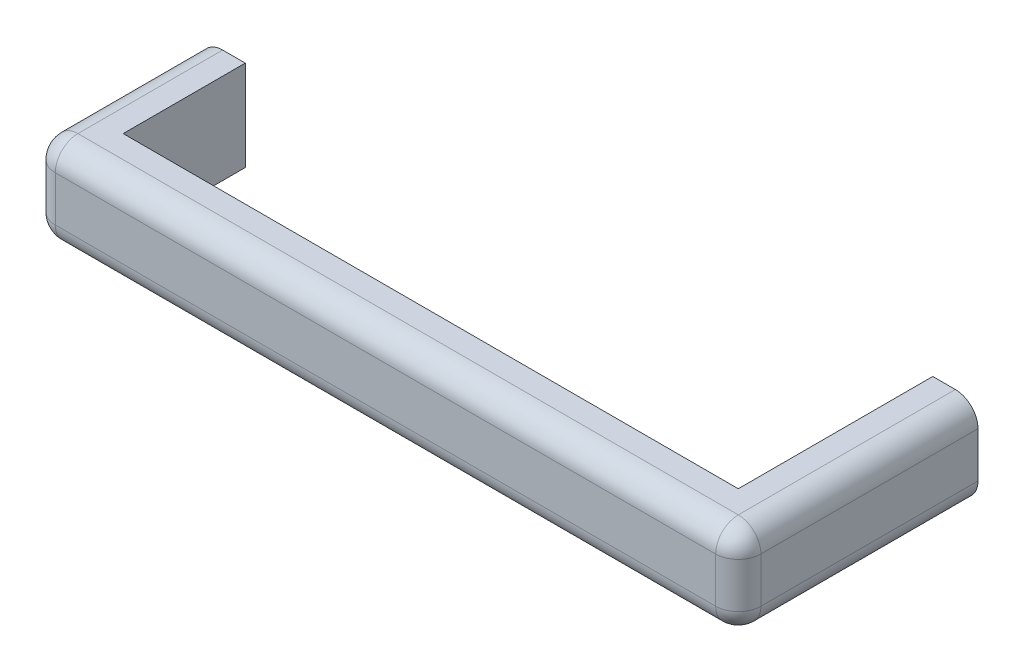
ISO-10303-21;
HEADER;
FILE_DESCRIPTION(('STEP AP214'),'2;1');
FILE_NAME('part.step','',(''),(''),'','','');
FILE_SCHEMA(('AUTOMOTIVE_DESIGN { 1 0 10303 214 1 1 1 1 }'));
ENDSEC;
DATA;
#1=APPLICATION_CONTEXT('core data for automotive mechanical design processes');
#2=APPLICATION_PROTOCOL_DEFINITION('international standard','automotive_design',2000,#1);
#3=PRODUCT_CONTEXT('',#1,'mechanical');
#4=PRODUCT('Part','Part','',(#3));
#5=PRODUCT_RELATED_PRODUCT_CATEGORY('part','',(#4));
#6=PRODUCT_DEFINITION_FORMATION('','',#4);
#7=PRODUCT_DEFINITION_CONTEXT('part definition',#1,'design');
#8=PRODUCT_DEFINITION('design','',#6,#7);
#9=PRODUCT_DEFINITION_SHAPE('','',#8);
#10=(LENGTH_UNIT() NAMED_UNIT(*) SI_UNIT(.MILLI.,.METRE.));
#11=(NAMED_UNIT(*) PLANE_ANGLE_UNIT() SI_UNIT($,.RADIAN.));
#12=(NAMED_UNIT(*) SI_UNIT($,.STERADIAN.) SOLID_ANGLE_UNIT());
#13=UNCERTAINTY_MEASURE_WITH_UNIT(LENGTH_MEASURE(1.E-05),#10,'distance_accuracy_value','');
#14=(GEOMETRIC_REPRESENTATION_CONTEXT(3) GLOBAL_UNCERTAINTY_ASSIGNED_CONTEXT((#13)) GLOBAL_UNIT_ASSIGNED_CONTEXT((#10,
#11,#12)) REPRESENTATION_CONTEXT('',''));
#15=CARTESIAN_POINT('',(0.,0.,0.));
#16=DIRECTION('',(0.,0.,1.));
#17=DIRECTION('',(1.,0.,0.));
#18=AXIS2_PLACEMENT_3D('',#15,#16,#17);
#19=CARTESIAN_POINT('',(0.,127.,-63.4999999999999));
#20=DIRECTION('',(1.,0.,0.));
#21=DIRECTION('',(0.,0.,-1.));
#22=AXIS2_PLACEMENT_3D('',#19,#20,#21);
#23=PLANE('',#22);
#24=DIRECTION('',(0.,-1.,0.));
#25=VECTOR('',#24,1.);
#26=CARTESIAN_POINT('',(0.,127.,-234.95));
#27=LINE('',#26,#25);
#28=CARTESIAN_POINT('',(0.,95.25,-234.95));
#29=VERTEX_POINT('',#28);
#30=CARTESIAN_POINT('',(0.,31.75,-234.95));
#31=VERTEX_POINT('',#30);
#32=EDGE_CURVE('E165',#29,#31,#27,.T.);
#33=ORIENTED_EDGE('',*,*,#32,.T.);
#34=DIRECTION('',(0.,0.,1.));
#35=VECTOR('',#34,1.);
#36=CARTESIAN_POINT('',(0.,31.75,0.));
#37=LINE('',#36,#35);
#38=CARTESIAN_POINT('',(0.,31.75,-31.75));
#39=VERTEX_POINT('',#38);
#40=EDGE_CURVE('E205',#31,#39,#37,.T.);
#41=ORIENTED_EDGE('',*,*,#40,.T.);
#42=DIRECTION('',(0.,-1.,0.));
#43=VECTOR('',#42,1.);
#44=CARTESIAN_POINT('',(0.,127.,-31.75));
#45=LINE('',#44,#43);
#46=CARTESIAN_POINT('',(0.,95.25,-31.75));
#47=VERTEX_POINT('',#46);
#48=EDGE_CURVE('E203',#39,#47,#45,.F.);
#49=ORIENTED_EDGE('',*,*,#48,.T.);
#50=DIRECTION('',(0.,0.,1.));
#51=VECTOR('',#50,1.);
#52=CARTESIAN_POINT('',(0.,95.25,-63.4999999999999));
#53=LINE('',#52,#51);
#54=EDGE_CURVE('E201',#47,#29,#53,.F.);
#55=ORIENTED_EDGE('',*,*,#54,.T.);
#56=EDGE_LOOP('',(#33,#41,#49,#55));
#57=FACE_BOUND('',#56,.T.);
#58=ADVANCED_FACE('F34',(#57),#23,.F.);
#59=CARTESIAN_POINT('',(0.,127.,0.));
#60=DIRECTION('',(0.,0.,-1.));
#61=DIRECTION('',(-1.,0.,0.));
#62=AXIS2_PLACEMENT_3D('',#59,#60,#61);
#63=PLANE('',#62);
#64=DIRECTION('',(0.,-1.,0.));
#65=VECTOR('',#64,1.);
#66=CARTESIAN_POINT('',(31.7499999999999,127.,0.));
#67=LINE('',#66,#65);
#68=CARTESIAN_POINT('',(31.7499999999999,95.25,0.));
#69=VERTEX_POINT('',#68);
#70=CARTESIAN_POINT('',(31.7499999999999,31.75,0.));
#71=VERTEX_POINT('',#70);
#72=EDGE_CURVE('E194',#69,#71,#67,.T.);
#73=ORIENTED_EDGE('',*,*,#72,.T.);
#74=DIRECTION('',(1.,0.,0.));
#75=VECTOR('',#74,1.);
#76=CARTESIAN_POINT('',(990.599999999999,31.75,0.));
#77=LINE('',#76,#75);
#78=CARTESIAN_POINT('',(958.85,31.75,0.));
#79=VERTEX_POINT('',#78);
#80=EDGE_CURVE('E199',#71,#79,#77,.T.);
#81=ORIENTED_EDGE('',*,*,#80,.T.);
#82=DIRECTION('',(0.,-1.,0.));
#83=VECTOR('',#82,1.);
#84=CARTESIAN_POINT('',(958.85,127.,0.));
#85=LINE('',#84,#83);
#86=CARTESIAN_POINT('',(958.85,95.25,0.));
#87=VERTEX_POINT('',#86);
#88=EDGE_CURVE('E196',#79,#87,#85,.F.);
#89=ORIENTED_EDGE('',*,*,#88,.T.);
#90=DIRECTION('',(1.,0.,0.));
#91=VECTOR('',#90,1.);
#92=CARTESIAN_POINT('',(0.,95.25,0.));
#93=LINE('',#92,#91);
#94=EDGE_CURVE('E192',#87,#69,#93,.F.);
#95=ORIENTED_EDGE('',*,*,#94,.T.);
#96=EDGE_LOOP('',(#73,#81,#89,#95));
#97=FACE_BOUND('',#96,.T.);
#98=ADVANCED_FACE('F319',(#97),#63,.F.);
#99=CARTESIAN_POINT('',(990.599999999999,127.,-63.5));
#100=DIRECTION('',(-1.,0.,0.));
#101=DIRECTION('',(0.,0.,1.));
#102=AXIS2_PLACEMENT_3D('',#99,#100,#101);
#103=PLANE('',#102);
#104=DIRECTION('',(0.,-1.,0.));
#105=VECTOR('',#104,1.);
#106=CARTESIAN_POINT('',(990.599999999999,127.,-31.75));
#107=LINE('',#106,#105);
#108=CARTESIAN_POINT('',(990.599999999999,95.25,-31.75));
#109=VERTEX_POINT('',#108);
#110=CARTESIAN_POINT('',(990.599999999999,31.75,-31.75));
#111=VERTEX_POINT('',#110);
#112=EDGE_CURVE('E187',#109,#111,#107,.T.);
#113=ORIENTED_EDGE('',*,*,#112,.T.);
#114=DIRECTION('',(0.,0.,-1.));
#115=VECTOR('',#114,1.);
#116=CARTESIAN_POINT('',(990.599999999999,31.75,-336.55));
#117=LINE('',#116,#115);
#118=CARTESIAN_POINT('',(990.599999999999,31.75,-336.55));
#119=VERTEX_POINT('',#118);
#120=EDGE_CURVE('E190',#111,#119,#117,.T.);
#121=ORIENTED_EDGE('',*,*,#120,.T.);
#122=DIRECTION('',(0.,-1.,0.));
#123=VECTOR('',#122,1.);
#124=CARTESIAN_POINT('',(990.599999999999,127.,-336.55));
#125=LINE('',#124,#123);
#126=CARTESIAN_POINT('',(990.599999999999,95.25,-336.55));
#127=VERTEX_POINT('',#126);
#128=EDGE_CURVE('E151',#127,#119,#125,.T.);
#129=ORIENTED_EDGE('',*,*,#128,.F.);
#130=DIRECTION('',(0.,0.,-1.));
#131=VECTOR('',#130,1.);
#132=CARTESIAN_POINT('',(990.599999999999,95.25,-63.5));
#133=LINE('',#132,#131);
#134=EDGE_CURVE('E185',#127,#109,#133,.F.);
#135=ORIENTED_EDGE('',*,*,#134,.T.);
#136=EDGE_LOOP('',(#113,#121,#129,#135));
#137=FACE_BOUND('',#136,.T.);
#138=ADVANCED_FACE('F275',(#137),#103,.F.);
#139=CARTESIAN_POINT('',(990.599999999999,127.,-336.55));
#140=DIRECTION('',(0.,0.,1.));
#141=DIRECTION('',(1.,0.,0.));
#142=AXIS2_PLACEMENT_3D('',#139,#140,#141);
#143=PLANE('',#142);
#144=ORIENTED_EDGE('',*,*,#128,.T.);
#145=CARTESIAN_POINT('',(958.85,31.75,-336.55));
#146=DIRECTION('',(0.,0.,1.));
#147=DIRECTION('',(1.,0.,0.));
#148=AXIS2_PLACEMENT_3D('',#145,#146,#147);
#149=CIRCLE('',#148,31.75);
#150=CARTESIAN_POINT('',(958.85,0.,-336.55));
#151=VERTEX_POINT('',#150);
#152=EDGE_CURVE('E209',#119,#151,#149,.F.);
#153=ORIENTED_EDGE('',*,*,#152,.T.);
#154=DIRECTION('',(-1.,0.,0.));
#155=VECTOR('',#154,1.);
#156=CARTESIAN_POINT('',(990.599999999999,0.,-336.55));
#157=LINE('',#156,#155);
#158=CARTESIAN_POINT('',(927.099999999999,0.,-336.55));
#159=VERTEX_POINT('',#158);
#160=EDGE_CURVE('E148',#151,#159,#157,.T.);
#161=ORIENTED_EDGE('',*,*,#160,.T.);
#162=DIRECTION('',(0.,-1.,0.));
#163=VECTOR('',#162,1.);
#164=CARTESIAN_POINT('',(927.099999999999,127.,-336.55));
#165=LINE('',#164,#163);
#166=CARTESIAN_POINT('',(927.099999999999,127.,-336.55));
#167=VERTEX_POINT('',#166);
#168=EDGE_CURVE('E144',#167,#159,#165,.T.);
#169=ORIENTED_EDGE('',*,*,#168,.F.);
#170=DIRECTION('',(-1.,0.,0.));
#171=VECTOR('',#170,1.);
#172=CARTESIAN_POINT('',(990.599999999999,127.,-336.55));
#173=LINE('',#172,#171);
#174=CARTESIAN_POINT('',(958.85,127.,-336.55));
#175=VERTEX_POINT('',#174);
#176=EDGE_CURVE('E133',#175,#167,#173,.T.);
#177=ORIENTED_EDGE('',*,*,#176,.F.);
#178=CARTESIAN_POINT('',(958.85,95.25,-336.55));
#179=DIRECTION('',(0.,0.,1.));
#180=DIRECTION('',(1.,0.,0.));
#181=AXIS2_PLACEMENT_3D('',#178,#179,#180);
#182=CIRCLE('',#181,31.75);
#183=EDGE_CURVE('E207',#175,#127,#182,.F.);
#184=ORIENTED_EDGE('',*,*,#183,.T.);
#185=EDGE_LOOP('',(#144,#153,#161,#169,#177,#184));
#186=FACE_BOUND('',#185,.T.);
#187=ADVANCED_FACE('F146',(#186),#143,.F.);
#188=CARTESIAN_POINT('',(927.099999999999,127.,-63.5));
#189=DIRECTION('',(1.,0.,0.));
#190=DIRECTION('',(0.,0.,-1.));
#191=AXIS2_PLACEMENT_3D('',#188,#189,#190);
#192=PLANE('',#191);
#193=DIRECTION('',(0.,0.,1.));
#194=VECTOR('',#193,1.);
#195=CARTESIAN_POINT('',(927.099999999999,0.,-63.5));
#196=LINE('',#195,#194);
#197=CARTESIAN_POINT('',(927.099999999999,0.,-63.5));
#198=VERTEX_POINT('',#197);
#199=EDGE_CURVE('E167',#159,#198,#196,.T.);
#200=ORIENTED_EDGE('',*,*,#199,.T.);
#201=DIRECTION('',(0.,-1.,0.));
#202=VECTOR('',#201,1.);
#203=CARTESIAN_POINT('',(927.099999999999,127.,-63.5));
#204=LINE('',#203,#202);
#205=CARTESIAN_POINT('',(927.099999999999,127.,-63.5));
#206=VERTEX_POINT('',#205);
#207=EDGE_CURVE('E152',#206,#198,#204,.T.);
#208=ORIENTED_EDGE('',*,*,#207,.F.);
#209=DIRECTION('',(0.,0.,1.));
#210=VECTOR('',#209,1.);
#211=CARTESIAN_POINT('',(927.099999999999,127.,-63.5));
#212=LINE('',#211,#210);
#213=EDGE_CURVE('E137',#167,#206,#212,.T.);
#214=ORIENTED_EDGE('',*,*,#213,.F.);
#215=ORIENTED_EDGE('',*,*,#168,.T.);
#216=EDGE_LOOP('',(#200,#208,#214,#215));
#217=FACE_BOUND('',#216,.T.);
#218=ADVANCED_FACE('F154',(#217),#192,.F.);
#219=CARTESIAN_POINT('',(63.5000000000001,127.,-63.5));
#220=DIRECTION('',(0.,0.,1.));
#221=DIRECTION('',(1.,0.,0.));
#222=AXIS2_PLACEMENT_3D('',#219,#220,#221);
#223=PLANE('',#222);
#224=DIRECTION('',(-1.,0.,0.));
#225=VECTOR('',#224,1.);
#226=CARTESIAN_POINT('',(63.5000000000001,0.,-63.5));
#227=LINE('',#226,#225);
#228=CARTESIAN_POINT('',(63.5000000000001,0.,-63.5));
#229=VERTEX_POINT('',#228);
#230=EDGE_CURVE('E169',#198,#229,#227,.T.);
#231=ORIENTED_EDGE('',*,*,#230,.T.);
#232=DIRECTION('',(0.,-1.,0.));
#233=VECTOR('',#232,1.);
#234=CARTESIAN_POINT('',(63.5000000000001,127.,-63.5));
#235=LINE('',#234,#233);
#236=CARTESIAN_POINT('',(63.5000000000001,127.,-63.5));
#237=VERTEX_POINT('',#236);
#238=EDGE_CURVE('E180',#237,#229,#235,.T.);
#239=ORIENTED_EDGE('',*,*,#238,.F.);
#240=DIRECTION('',(-1.,0.,0.));
#241=VECTOR('',#240,1.);
#242=CARTESIAN_POINT('',(63.5000000000001,127.,-63.5));
#243=LINE('',#242,#241);
#244=EDGE_CURVE('E157',#206,#237,#243,.T.);
#245=ORIENTED_EDGE('',*,*,#244,.F.);
#246=ORIENTED_EDGE('',*,*,#207,.T.);
#247=EDGE_LOOP('',(#231,#239,#245,#246));
#248=FACE_BOUND('',#247,.T.);
#249=ADVANCED_FACE('F287',(#248),#223,.F.);
#250=CARTESIAN_POINT('',(63.5000000000001,127.,-63.5));
#251=DIRECTION('',(-1.,0.,0.));
#252=DIRECTION('',(0.,0.,1.));
#253=AXIS2_PLACEMENT_3D('',#250,#251,#252);
#254=PLANE('',#253);
#255=DIRECTION('',(0.,0.,-1.));
#256=VECTOR('',#255,1.);
#257=CARTESIAN_POINT('',(63.5000000000001,0.,-63.5));
#258=LINE('',#257,#256);
#259=CARTESIAN_POINT('',(63.5000000000001,0.,-234.95));
#260=VERTEX_POINT('',#259);
#261=EDGE_CURVE('E171',#229,#260,#258,.T.);
#262=ORIENTED_EDGE('',*,*,#261,.T.);
#263=DIRECTION('',(0.,-1.,0.));
#264=VECTOR('',#263,1.);
#265=CARTESIAN_POINT('',(63.5000000000001,127.,-234.95));
#266=LINE('',#265,#264);
#267=CARTESIAN_POINT('',(63.5000000000001,127.,-234.95));
#268=VERTEX_POINT('',#267);
#269=EDGE_CURVE('E177',#268,#260,#266,.T.);
#270=ORIENTED_EDGE('',*,*,#269,.F.);
#271=DIRECTION('',(0.,0.,-1.));
#272=VECTOR('',#271,1.);
#273=CARTESIAN_POINT('',(63.5000000000001,127.,-63.5));
#274=LINE('',#273,#272);
#275=EDGE_CURVE('E159',#237,#268,#274,.T.);
#276=ORIENTED_EDGE('',*,*,#275,.F.);
#277=ORIENTED_EDGE('',*,*,#238,.T.);
#278=EDGE_LOOP('',(#262,#270,#276,#277));
#279=FACE_BOUND('',#278,.T.);
#280=ADVANCED_FACE('F293',(#279),#254,.F.);
#281=CARTESIAN_POINT('',(0.,127.,-234.95));
#282=DIRECTION('',(0.,0.,1.));
#283=DIRECTION('',(1.,0.,0.));
#284=AXIS2_PLACEMENT_3D('',#281,#282,#283);
#285=PLANE('',#284);
#286=DIRECTION('',(-1.,0.,0.));
#287=VECTOR('',#286,1.);
#288=CARTESIAN_POINT('',(0.,0.,-234.95));
#289=LINE('',#288,#287);
#290=CARTESIAN_POINT('',(31.7499999999999,0.,-234.95));
#291=VERTEX_POINT('',#290);
#292=EDGE_CURVE('E141',#260,#291,#289,.T.);
#293=ORIENTED_EDGE('',*,*,#292,.T.);
#294=CARTESIAN_POINT('',(31.7499999999999,31.75,-234.95));
#295=DIRECTION('',(0.,0.,1.));
#296=DIRECTION('',(1.,0.,0.));
#297=AXIS2_PLACEMENT_3D('',#294,#295,#296);
#298=CIRCLE('',#297,31.75);
#299=EDGE_CURVE('E219',#291,#31,#298,.F.);
#300=ORIENTED_EDGE('',*,*,#299,.T.);
#301=ORIENTED_EDGE('',*,*,#32,.F.);
#302=CARTESIAN_POINT('',(31.7499999999999,95.25,-234.95));
#303=DIRECTION('',(0.,0.,1.));
#304=DIRECTION('',(1.,0.,0.));
#305=AXIS2_PLACEMENT_3D('',#302,#303,#304);
#306=CIRCLE('',#305,31.75);
#307=CARTESIAN_POINT('',(31.7499999999999,127.,-234.95));
#308=VERTEX_POINT('',#307);
#309=EDGE_CURVE('E217',#29,#308,#306,.F.);
#310=ORIENTED_EDGE('',*,*,#309,.T.);
#311=DIRECTION('',(-1.,0.,0.));
#312=VECTOR('',#311,1.);
#313=CARTESIAN_POINT('',(0.,127.,-234.95));
#314=LINE('',#313,#312);
#315=EDGE_CURVE('E163',#268,#308,#314,.T.);
#316=ORIENTED_EDGE('',*,*,#315,.F.);
#317=ORIENTED_EDGE('',*,*,#269,.T.);
#318=EDGE_LOOP('',(#293,#300,#301,#310,#316,#317));
#319=FACE_BOUND('',#318,.T.);
#320=ADVANCED_FACE('F296',(#319),#285,.F.);
#321=CARTESIAN_POINT('',(0.,127.,0.));
#322=DIRECTION('',(0.,-1.,0.));
#323=DIRECTION('',(0.,0.,-1.));
#324=AXIS2_PLACEMENT_3D('',#321,#322,#323);
#325=PLANE('',#324);
#326=DIRECTION('',(1.,0.,0.));
#327=VECTOR('',#326,1.);
#328=CARTESIAN_POINT('',(0.,127.,-31.75));
#329=LINE('',#328,#327);
#330=CARTESIAN_POINT('',(31.7499999999999,127.,-31.75));
#331=VERTEX_POINT('',#330);
#332=CARTESIAN_POINT('',(958.85,127.,-31.75));
#333=VERTEX_POINT('',#332);
#334=EDGE_CURVE('E50',#331,#333,#329,.T.);
#335=ORIENTED_EDGE('',*,*,#334,.T.);
#336=DIRECTION('',(0.,0.,-1.));
#337=VECTOR('',#336,1.);
#338=CARTESIAN_POINT('',(958.85,127.,0.));
#339=LINE('',#338,#337);
#340=EDGE_CURVE('E11',#333,#175,#339,.T.);
#341=ORIENTED_EDGE('',*,*,#340,.T.);
#342=ORIENTED_EDGE('',*,*,#176,.T.);
#343=ORIENTED_EDGE('',*,*,#213,.T.);
#344=ORIENTED_EDGE('',*,*,#244,.T.);
#345=ORIENTED_EDGE('',*,*,#275,.T.);
#346=ORIENTED_EDGE('',*,*,#315,.T.);
#347=DIRECTION('',(0.,0.,1.));
#348=VECTOR('',#347,1.);
#349=CARTESIAN_POINT('',(31.7499999999999,127.,0.));
#350=LINE('',#349,#348);
#351=EDGE_CURVE('E43',#308,#331,#350,.T.);
#352=ORIENTED_EDGE('',*,*,#351,.T.);
#353=EDGE_LOOP('',(#335,#341,#342,#343,#344,#345,#346,#352));
#354=FACE_BOUND('',#353,.T.);
#355=ADVANCED_FACE('F135',(#354),#325,.F.);
#356=CARTESIAN_POINT('',(0.,0.,0.));
#357=DIRECTION('',(0.,-1.,0.));
#358=DIRECTION('',(0.,0.,-1.));
#359=AXIS2_PLACEMENT_3D('',#356,#357,#358);
#360=PLANE('',#359);
#361=ORIENTED_EDGE('',*,*,#160,.F.);
#362=DIRECTION('',(0.,0.,-1.));
#363=VECTOR('',#362,1.);
#364=CARTESIAN_POINT('',(958.85,0.,0.));
#365=LINE('',#364,#363);
#366=CARTESIAN_POINT('',(958.85,0.,-31.75));
#367=VERTEX_POINT('',#366);
#368=EDGE_CURVE('E215',#151,#367,#365,.F.);
#369=ORIENTED_EDGE('',*,*,#368,.T.);
#370=DIRECTION('',(1.,0.,0.));
#371=VECTOR('',#370,1.);
#372=CARTESIAN_POINT('',(0.,0.,-31.75));
#373=LINE('',#372,#371);
#374=CARTESIAN_POINT('',(31.7499999999999,0.,-31.75));
#375=VERTEX_POINT('',#374);
#376=EDGE_CURVE('E211',#367,#375,#373,.F.);
#377=ORIENTED_EDGE('',*,*,#376,.T.);
#378=DIRECTION('',(0.,0.,1.));
#379=VECTOR('',#378,1.);
#380=CARTESIAN_POINT('',(31.7499999999999,0.,-234.95));
#381=LINE('',#380,#379);
#382=EDGE_CURVE('E213',#375,#291,#381,.F.);
#383=ORIENTED_EDGE('',*,*,#382,.T.);
#384=ORIENTED_EDGE('',*,*,#292,.F.);
#385=ORIENTED_EDGE('',*,*,#261,.F.);
#386=ORIENTED_EDGE('',*,*,#230,.F.);
#387=ORIENTED_EDGE('',*,*,#199,.F.);
#388=EDGE_LOOP('',(#361,#369,#377,#383,#384,#385,#386,#387));
#389=FACE_BOUND('',#388,.T.);
#390=ADVANCED_FACE('F282',(#389),#360,.T.);
#391=CARTESIAN_POINT('',(31.7499999999999,95.25,0.));
#392=DIRECTION('',(0.,0.,1.));
#393=DIRECTION('',(1.,0.,0.));
#394=AXIS2_PLACEMENT_3D('',#391,#392,#393);
#395=CYLINDRICAL_SURFACE('',#394,31.75);
#396=ORIENTED_EDGE('',*,*,#309,.F.);
#397=ORIENTED_EDGE('',*,*,#54,.F.);
#398=CARTESIAN_POINT('',(31.7499999999999,95.25,-31.75));
#399=DIRECTION('',(0.,0.,1.));
#400=DIRECTION('',(1.,0.,0.));
#401=AXIS2_PLACEMENT_3D('',#398,#399,#400);
#402=CIRCLE('',#401,31.75);
#403=EDGE_CURVE('E250',#331,#47,#402,.T.);
#404=ORIENTED_EDGE('',*,*,#403,.F.);
#405=ORIENTED_EDGE('',*,*,#351,.F.);
#406=EDGE_LOOP('',(#396,#397,#404,#405));
#407=FACE_BOUND('',#406,.T.);
#408=ADVANCED_FACE('F36',(#407),#395,.T.);
#409=CARTESIAN_POINT('',(31.7499999999999,31.75,-63.4999999999999));
#410=DIRECTION('',(0.,0.,-1.));
#411=DIRECTION('',(-1.,0.,0.));
#412=AXIS2_PLACEMENT_3D('',#409,#410,#411);
#413=CYLINDRICAL_SURFACE('',#412,31.75);
#414=ORIENTED_EDGE('',*,*,#299,.F.);
#415=ORIENTED_EDGE('',*,*,#382,.F.);
#416=CARTESIAN_POINT('',(31.7499999999999,31.75,-31.75));
#417=DIRECTION('',(0.,0.,1.));
#418=DIRECTION('',(1.,0.,0.));
#419=AXIS2_PLACEMENT_3D('',#416,#417,#418);
#420=CIRCLE('',#419,31.75);
#421=EDGE_CURVE('E248',#39,#375,#420,.T.);
#422=ORIENTED_EDGE('',*,*,#421,.F.);
#423=ORIENTED_EDGE('',*,*,#40,.F.);
#424=EDGE_LOOP('',(#414,#415,#422,#423));
#425=FACE_BOUND('',#424,.T.);
#426=ADVANCED_FACE('F310',(#425),#413,.T.);
#427=CARTESIAN_POINT('',(31.7499999999999,127.,-31.75));
#428=DIRECTION('',(0.,-1.,0.));
#429=DIRECTION('',(0.,0.,-1.));
#430=AXIS2_PLACEMENT_3D('',#427,#428,#429);
#431=CYLINDRICAL_SURFACE('',#430,31.75);
#432=CARTESIAN_POINT('',(31.7499999999999,95.25,-31.75));
#433=DIRECTION('',(0.,1.,0.));
#434=DIRECTION('',(0.,0.,1.));
#435=AXIS2_PLACEMENT_3D('',#432,#433,#434);
#436=CIRCLE('',#435,31.75);
#437=EDGE_CURVE('E38',#47,#69,#436,.T.);
#438=ORIENTED_EDGE('',*,*,#437,.F.);
#439=ORIENTED_EDGE('',*,*,#48,.F.);
#440=CARTESIAN_POINT('',(31.7499999999999,31.75,-31.75));
#441=DIRECTION('',(0.,-1.,0.));
#442=DIRECTION('',(0.,0.,-1.));
#443=AXIS2_PLACEMENT_3D('',#440,#441,#442);
#444=CIRCLE('',#443,31.75);
#445=EDGE_CURVE('E245',#71,#39,#444,.T.);
#446=ORIENTED_EDGE('',*,*,#445,.F.);
#447=ORIENTED_EDGE('',*,*,#72,.F.);
#448=EDGE_LOOP('',(#438,#439,#446,#447));
#449=FACE_BOUND('',#448,.T.);
#450=ADVANCED_FACE('F305',(#449),#431,.T.);
#451=CARTESIAN_POINT('',(31.7499999999999,95.25,-31.75));
#452=DIRECTION('',(0.,0.,1.));
#453=DIRECTION('',(1.,0.,0.));
#454=AXIS2_PLACEMENT_3D('',#451,#452,#453);
#455=SPHERICAL_SURFACE('',#454,31.75);
#456=ORIENTED_EDGE('',*,*,#403,.T.);
#457=ORIENTED_EDGE('',*,*,#437,.T.);
#458=CARTESIAN_POINT('',(31.7499999999999,95.25,-31.75));
#459=DIRECTION('',(-1.,0.,0.));
#460=DIRECTION('',(0.,0.,1.));
#461=AXIS2_PLACEMENT_3D('',#458,#459,#460);
#462=CIRCLE('',#461,31.75);
#463=EDGE_CURVE('E242',#331,#69,#462,.F.);
#464=ORIENTED_EDGE('',*,*,#463,.F.);
#465=EDGE_LOOP('',(#456,#457,#464));
#466=FACE_BOUND('',#465,.T.);
#467=ADVANCED_FACE('F256',(#466),#455,.T.);
#468=CARTESIAN_POINT('',(31.7499999999999,31.75,-31.75));
#469=DIRECTION('',(0.,0.,1.));
#470=DIRECTION('',(1.,0.,0.));
#471=AXIS2_PLACEMENT_3D('',#468,#469,#470);
#472=SPHERICAL_SURFACE('',#471,31.75);
#473=ORIENTED_EDGE('',*,*,#445,.T.);
#474=ORIENTED_EDGE('',*,*,#421,.T.);
#475=CARTESIAN_POINT('',(31.7499999999999,31.75,-31.75));
#476=DIRECTION('',(-1.,0.,0.));
#477=DIRECTION('',(0.,0.,1.));
#478=AXIS2_PLACEMENT_3D('',#475,#476,#477);
#479=CIRCLE('',#478,31.75);
#480=EDGE_CURVE('E239',#71,#375,#479,.F.);
#481=ORIENTED_EDGE('',*,*,#480,.F.);
#482=EDGE_LOOP('',(#473,#474,#481));
#483=FACE_BOUND('',#482,.T.);
#484=ADVANCED_FACE('F312',(#483),#472,.T.);
#485=CARTESIAN_POINT('',(0.,95.25,-31.75));
#486=DIRECTION('',(1.,0.,0.));
#487=DIRECTION('',(0.,0.,-1.));
#488=AXIS2_PLACEMENT_3D('',#485,#486,#487);
#489=CYLINDRICAL_SURFACE('',#488,31.75);
#490=ORIENTED_EDGE('',*,*,#463,.T.);
#491=ORIENTED_EDGE('',*,*,#94,.F.);
#492=CARTESIAN_POINT('',(958.85,95.25,-31.75));
#493=DIRECTION('',(1.,0.,0.));
#494=DIRECTION('',(0.,0.,-1.));
#495=AXIS2_PLACEMENT_3D('',#492,#493,#494);
#496=CIRCLE('',#495,31.75);
#497=EDGE_CURVE('E236',#333,#87,#496,.T.);
#498=ORIENTED_EDGE('',*,*,#497,.F.);
#499=ORIENTED_EDGE('',*,*,#334,.F.);
#500=EDGE_LOOP('',(#490,#491,#498,#499));
#501=FACE_BOUND('',#500,.T.);
#502=ADVANCED_FACE('F262',(#501),#489,.T.);
#503=CARTESIAN_POINT('',(958.85,95.25,0.));
#504=DIRECTION('',(0.,0.,-1.));
#505=DIRECTION('',(-1.,0.,0.));
#506=AXIS2_PLACEMENT_3D('',#503,#504,#505);
#507=CYLINDRICAL_SURFACE('',#506,31.75);
#508=ORIENTED_EDGE('',*,*,#183,.F.);
#509=ORIENTED_EDGE('',*,*,#340,.F.);
#510=CARTESIAN_POINT('',(958.85,95.25,-31.75));
#511=DIRECTION('',(0.,0.,1.));
#512=DIRECTION('',(1.,0.,0.));
#513=AXIS2_PLACEMENT_3D('',#510,#511,#512);
#514=CIRCLE('',#513,31.75);
#515=EDGE_CURVE('E233',#109,#333,#514,.T.);
#516=ORIENTED_EDGE('',*,*,#515,.F.);
#517=ORIENTED_EDGE('',*,*,#134,.F.);
#518=EDGE_LOOP('',(#508,#509,#516,#517));
#519=FACE_BOUND('',#518,.T.);
#520=ADVANCED_FACE('F271',(#519),#507,.T.);
#521=CARTESIAN_POINT('',(958.85,31.75,-63.5));
#522=DIRECTION('',(0.,0.,1.));
#523=DIRECTION('',(1.,0.,0.));
#524=AXIS2_PLACEMENT_3D('',#521,#522,#523);
#525=CYLINDRICAL_SURFACE('',#524,31.75);
#526=ORIENTED_EDGE('',*,*,#152,.F.);
#527=ORIENTED_EDGE('',*,*,#120,.F.);
#528=CARTESIAN_POINT('',(958.85,31.75,-31.75));
#529=DIRECTION('',(0.,0.,1.));
#530=DIRECTION('',(1.,0.,0.));
#531=AXIS2_PLACEMENT_3D('',#528,#529,#530);
#532=CIRCLE('',#531,31.75);
#533=EDGE_CURVE('E230',#367,#111,#532,.T.);
#534=ORIENTED_EDGE('',*,*,#533,.F.);
#535=ORIENTED_EDGE('',*,*,#368,.F.);
#536=EDGE_LOOP('',(#526,#527,#534,#535));
#537=FACE_BOUND('',#536,.T.);
#538=ADVANCED_FACE('F279',(#537),#525,.T.);
#539=CARTESIAN_POINT('',(0.,31.75,-31.75));
#540=DIRECTION('',(-1.,0.,0.));
#541=DIRECTION('',(0.,0.,1.));
#542=AXIS2_PLACEMENT_3D('',#539,#540,#541);
#543=CYLINDRICAL_SURFACE('',#542,31.75);
#544=ORIENTED_EDGE('',*,*,#480,.T.);
#545=ORIENTED_EDGE('',*,*,#376,.F.);
#546=CARTESIAN_POINT('',(958.85,31.75,-31.75));
#547=DIRECTION('',(1.,0.,0.));
#548=DIRECTION('',(0.,0.,-1.));
#549=AXIS2_PLACEMENT_3D('',#546,#547,#548);
#550=CIRCLE('',#549,31.75);
#551=EDGE_CURVE('E227',#79,#367,#550,.T.);
#552=ORIENTED_EDGE('',*,*,#551,.F.);
#553=ORIENTED_EDGE('',*,*,#80,.F.);
#554=EDGE_LOOP('',(#544,#545,#552,#553));
#555=FACE_BOUND('',#554,.T.);
#556=ADVANCED_FACE('F316',(#555),#543,.T.);
#557=CARTESIAN_POINT('',(958.85,95.25,-31.75));
#558=DIRECTION('',(0.,0.,1.));
#559=DIRECTION('',(1.,0.,0.));
#560=AXIS2_PLACEMENT_3D('',#557,#558,#559);
#561=SPHERICAL_SURFACE('',#560,31.75);
#562=ORIENTED_EDGE('',*,*,#515,.T.);
#563=ORIENTED_EDGE('',*,*,#497,.T.);
#564=CARTESIAN_POINT('',(958.85,95.25,-31.75));
#565=DIRECTION('',(0.,1.,0.));
#566=DIRECTION('',(0.,0.,1.));
#567=AXIS2_PLACEMENT_3D('',#564,#565,#566);
#568=CIRCLE('',#567,31.75);
#569=EDGE_CURVE('E225',#109,#87,#568,.F.);
#570=ORIENTED_EDGE('',*,*,#569,.F.);
#571=EDGE_LOOP('',(#562,#563,#570));
#572=FACE_BOUND('',#571,.T.);
#573=ADVANCED_FACE('F267',(#572),#561,.T.);
#574=CARTESIAN_POINT('',(958.85,31.75,-31.75));
#575=DIRECTION('',(0.,0.,1.));
#576=DIRECTION('',(1.,0.,0.));
#577=AXIS2_PLACEMENT_3D('',#574,#575,#576);
#578=SPHERICAL_SURFACE('',#577,31.75);
#579=ORIENTED_EDGE('',*,*,#551,.T.);
#580=ORIENTED_EDGE('',*,*,#533,.T.);
#581=CARTESIAN_POINT('',(958.85,31.75,-31.75));
#582=DIRECTION('',(0.,-1.,0.));
#583=DIRECTION('',(0.,0.,-1.));
#584=AXIS2_PLACEMENT_3D('',#581,#582,#583);
#585=CIRCLE('',#584,31.75);
#586=EDGE_CURVE('E223',#79,#111,#585,.F.);
#587=ORIENTED_EDGE('',*,*,#586,.F.);
#588=EDGE_LOOP('',(#579,#580,#587));
#589=FACE_BOUND('',#588,.T.);
#590=ADVANCED_FACE('F324',(#589),#578,.T.);
#591=CARTESIAN_POINT('',(958.85,127.,-31.75));
#592=DIRECTION('',(0.,-1.,0.));
#593=DIRECTION('',(0.,0.,-1.));
#594=AXIS2_PLACEMENT_3D('',#591,#592,#593);
#595=CYLINDRICAL_SURFACE('',#594,31.75);
#596=ORIENTED_EDGE('',*,*,#569,.T.);
#597=ORIENTED_EDGE('',*,*,#88,.F.);
#598=ORIENTED_EDGE('',*,*,#586,.T.);
#599=ORIENTED_EDGE('',*,*,#112,.F.);
#600=EDGE_LOOP('',(#596,#597,#598,#599));
#601=FACE_BOUND('',#600,.T.);
#602=ADVANCED_FACE('F322',(#601),#595,.T.);
#603=CLOSED_SHELL('',(#58,#98,#138,#187,#218,#249,#280,#320,#355,#390,#408,#426,#450,#467,#484,
#502,#520,#538,#556,#573,#590,#602));
#604=MANIFOLD_SOLID_BREP('B2',#603);
#605=ADVANCED_BREP_SHAPE_REPRESENTATION('',(#18,#604),#14);
#606=SHAPE_DEFINITION_REPRESENTATION(#9,#605);
ENDSEC;
END-ISO-10303-21;
